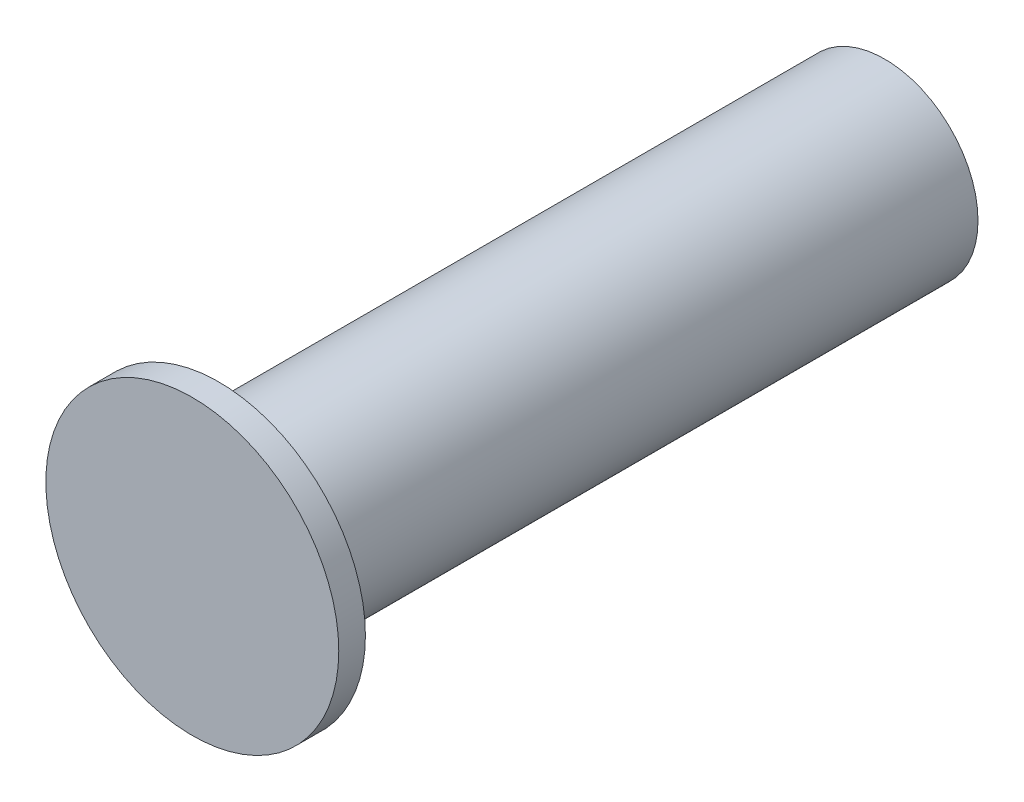
ISO-10303-21;
HEADER;
FILE_DESCRIPTION(('STEP AP214'),'2;1');
FILE_NAME('part.step','',(''),(''),'','','');
FILE_SCHEMA(('AUTOMOTIVE_DESIGN { 1 0 10303 214 1 1 1 1 }'));
ENDSEC;
DATA;
#1=APPLICATION_CONTEXT('core data for automotive mechanical design processes');
#2=APPLICATION_PROTOCOL_DEFINITION('international standard','automotive_design',2000,#1);
#3=PRODUCT_CONTEXT('',#1,'mechanical');
#4=PRODUCT('Part','Part','',(#3));
#5=PRODUCT_RELATED_PRODUCT_CATEGORY('part','',(#4));
#6=PRODUCT_DEFINITION_FORMATION('','',#4);
#7=PRODUCT_DEFINITION_CONTEXT('part definition',#1,'design');
#8=PRODUCT_DEFINITION('design','',#6,#7);
#9=PRODUCT_DEFINITION_SHAPE('','',#8);
#10=(LENGTH_UNIT() NAMED_UNIT(*) SI_UNIT(.MILLI.,.METRE.));
#11=(NAMED_UNIT(*) PLANE_ANGLE_UNIT() SI_UNIT($,.RADIAN.));
#12=(NAMED_UNIT(*) SI_UNIT($,.STERADIAN.) SOLID_ANGLE_UNIT());
#13=UNCERTAINTY_MEASURE_WITH_UNIT(LENGTH_MEASURE(1.E-05),#10,'distance_accuracy_value','');
#14=(GEOMETRIC_REPRESENTATION_CONTEXT(3) GLOBAL_UNCERTAINTY_ASSIGNED_CONTEXT((#13)) GLOBAL_UNIT_ASSIGNED_CONTEXT((#10,
#11,#12)) REPRESENTATION_CONTEXT('',''));
#15=CARTESIAN_POINT('',(0.,0.,0.));
#16=DIRECTION('',(0.,0.,1.));
#17=DIRECTION('',(1.,0.,0.));
#18=AXIS2_PLACEMENT_3D('',#15,#16,#17);
#19=CARTESIAN_POINT('',(0.,0.,0.508));
#20=DIRECTION('',(0.,0.,-1.));
#21=DIRECTION('',(-1.,0.,0.));
#22=AXIS2_PLACEMENT_3D('',#19,#20,#21);
#23=CYLINDRICAL_SURFACE('',#22,2.794);
#24=CARTESIAN_POINT('',(0.,0.,0.508));
#25=DIRECTION('',(0.,0.,1.));
#26=DIRECTION('',(1.,0.,0.));
#27=AXIS2_PLACEMENT_3D('',#24,#25,#26);
#28=CIRCLE('',#27,2.794);
#29=CARTESIAN_POINT('',(2.794,0.,0.508));
#30=VERTEX_POINT('',#29);
#31=EDGE_CURVE('E38',#30,#30,#28,.T.);
#32=ORIENTED_EDGE('',*,*,#31,.F.);
#33=EDGE_LOOP('',(#32));
#34=FACE_BOUND('',#33,.T.);
#35=CARTESIAN_POINT('',(0.,0.,0.));
#36=DIRECTION('',(0.,0.,1.));
#37=DIRECTION('',(1.,0.,0.));
#38=AXIS2_PLACEMENT_3D('',#35,#36,#37);
#39=CIRCLE('',#38,2.794);
#40=CARTESIAN_POINT('',(2.794,0.,0.));
#41=VERTEX_POINT('',#40);
#42=EDGE_CURVE('E34',#41,#41,#39,.T.);
#43=ORIENTED_EDGE('',*,*,#42,.T.);
#44=EDGE_LOOP('',(#43));
#45=FACE_BOUND('',#44,.T.);
#46=ADVANCED_FACE('F31',(#34,#45),#23,.T.);
#47=CARTESIAN_POINT('',(0.,0.,0.508));
#48=DIRECTION('',(0.,0.,1.));
#49=DIRECTION('',(1.,0.,0.));
#50=AXIS2_PLACEMENT_3D('',#47,#48,#49);
#51=PLANE('',#50);
#52=ORIENTED_EDGE('',*,*,#31,.T.);
#53=EDGE_LOOP('',(#52));
#54=FACE_BOUND('',#53,.T.);
#55=ADVANCED_FACE('F55',(#54),#51,.T.);
#56=CARTESIAN_POINT('',(0.,0.,0.));
#57=DIRECTION('',(0.,0.,1.));
#58=DIRECTION('',(1.,0.,0.));
#59=AXIS2_PLACEMENT_3D('',#56,#57,#58);
#60=PLANE('',#59);
#61=CARTESIAN_POINT('',(0.,0.,0.));
#62=DIRECTION('',(0.,0.,-1.));
#63=DIRECTION('',(-1.,0.,0.));
#64=AXIS2_PLACEMENT_3D('',#61,#62,#63);
#65=CIRCLE('',#64,1.77952089415153);
#66=CARTESIAN_POINT('',(1.77952089415153,0.,0.));
#67=VERTEX_POINT('',#66);
#68=EDGE_CURVE('E10',#67,#67,#65,.T.);
#69=ORIENTED_EDGE('',*,*,#68,.F.);
#70=EDGE_LOOP('',(#69));
#71=FACE_BOUND('',#70,.T.);
#72=ORIENTED_EDGE('',*,*,#42,.F.);
#73=EDGE_LOOP('',(#72));
#74=FACE_BOUND('',#73,.T.);
#75=ADVANCED_FACE('F52',(#71,#74),#60,.F.);
#76=CARTESIAN_POINT('',(0.,0.,-12.7));
#77=DIRECTION('',(0.,0.,1.));
#78=DIRECTION('',(1.,0.,0.));
#79=AXIS2_PLACEMENT_3D('',#76,#77,#78);
#80=CYLINDRICAL_SURFACE('',#79,1.77952089415153);
#81=CARTESIAN_POINT('',(0.,0.,-12.7));
#82=DIRECTION('',(0.,0.,-1.));
#83=DIRECTION('',(-1.,0.,0.));
#84=AXIS2_PLACEMENT_3D('',#81,#82,#83);
#85=CIRCLE('',#84,1.77952089415153);
#86=CARTESIAN_POINT('',(1.77952089415153,0.,-12.7));
#87=VERTEX_POINT('',#86);
#88=EDGE_CURVE('E44',#87,#87,#85,.T.);
#89=CARTESIAN_POINT('',(1.77952089415153,0.,-12.7));
#90=CARTESIAN_POINT('',(1.77952089415153,0.,-12.5677083333333));
#91=CARTESIAN_POINT('',(1.77952089415153,0.,-12.4354166666667));
#92=CARTESIAN_POINT('',(1.77952089415153,0.,-12.1708333333333));
#93=CARTESIAN_POINT('',(1.77952089415153,0.,-12.0385416666667));
#94=CARTESIAN_POINT('',(1.77952089415153,0.,-11.7739583333333));
#95=CARTESIAN_POINT('',(1.77952089415153,0.,-11.6416666666667));
#96=CARTESIAN_POINT('',(1.77952089415153,0.,-11.3770833333333));
#97=CARTESIAN_POINT('',(1.77952089415153,0.,-11.2447916666667));
#98=CARTESIAN_POINT('',(1.77952089415153,0.,-10.9802083333333));
#99=CARTESIAN_POINT('',(1.77952089415153,0.,-10.8479166666667));
#100=CARTESIAN_POINT('',(1.77952089415153,0.,-10.5833333333333));
#101=CARTESIAN_POINT('',(1.77952089415153,0.,-10.4510416666667));
#102=CARTESIAN_POINT('',(1.77952089415153,0.,-10.1864583333333));
#103=CARTESIAN_POINT('',(1.77952089415153,0.,-10.0541666666667));
#104=CARTESIAN_POINT('',(1.77952089415153,0.,-9.78958333333333));
#105=CARTESIAN_POINT('',(1.77952089415153,0.,-9.65729166666667));
#106=CARTESIAN_POINT('',(1.77952089415153,0.,-9.39270833333333));
#107=CARTESIAN_POINT('',(1.77952089415153,0.,-9.26041666666667));
#108=CARTESIAN_POINT('',(1.77952089415153,0.,-8.99583333333334));
#109=CARTESIAN_POINT('',(1.77952089415153,0.,-8.86354166666667));
#110=CARTESIAN_POINT('',(1.77952089415153,0.,-8.59895833333334));
#111=CARTESIAN_POINT('',(1.77952089415153,0.,-8.46666666666667));
#112=CARTESIAN_POINT('',(1.77952089415153,0.,-8.20208333333333));
#113=CARTESIAN_POINT('',(1.77952089415153,0.,-8.06979166666667));
#114=CARTESIAN_POINT('',(1.77952089415153,0.,-7.80520833333333));
#115=CARTESIAN_POINT('',(1.77952089415153,0.,-7.67291666666667));
#116=CARTESIAN_POINT('',(1.77952089415153,0.,-7.40833333333333));
#117=CARTESIAN_POINT('',(1.77952089415153,0.,-7.27604166666667));
#118=CARTESIAN_POINT('',(1.77952089415153,0.,-7.01145833333333));
#119=CARTESIAN_POINT('',(1.77952089415153,0.,-6.87916666666667));
#120=CARTESIAN_POINT('',(1.77952089415153,0.,-6.61458333333333));
#121=CARTESIAN_POINT('',(1.77952089415153,0.,-6.48229166666667));
#122=CARTESIAN_POINT('',(1.77952089415153,0.,-6.21770833333333));
#123=CARTESIAN_POINT('',(1.77952089415153,0.,-6.08541666666667));
#124=CARTESIAN_POINT('',(1.77952089415153,0.,-5.82083333333333));
#125=CARTESIAN_POINT('',(1.77952089415153,0.,-5.68854166666667));
#126=CARTESIAN_POINT('',(1.77952089415153,0.,-5.42395833333333));
#127=CARTESIAN_POINT('',(1.77952089415153,0.,-5.29166666666667));
#128=CARTESIAN_POINT('',(1.77952089415153,0.,-5.02708333333333));
#129=CARTESIAN_POINT('',(1.77952089415153,0.,-4.89479166666667));
#130=CARTESIAN_POINT('',(1.77952089415153,0.,-4.63020833333333));
#131=CARTESIAN_POINT('',(1.77952089415153,0.,-4.49791666666667));
#132=CARTESIAN_POINT('',(1.77952089415153,0.,-4.23333333333333));
#133=CARTESIAN_POINT('',(1.77952089415153,0.,-4.10104166666667));
#134=CARTESIAN_POINT('',(1.77952089415153,0.,-3.83645833333333));
#135=CARTESIAN_POINT('',(1.77952089415153,0.,-3.70416666666667));
#136=CARTESIAN_POINT('',(1.77952089415153,0.,-3.43958333333333));
#137=CARTESIAN_POINT('',(1.77952089415153,0.,-3.30729166666667));
#138=CARTESIAN_POINT('',(1.77952089415153,0.,-3.04270833333333));
#139=CARTESIAN_POINT('',(1.77952089415153,0.,-2.91041666666667));
#140=CARTESIAN_POINT('',(1.77952089415153,0.,-2.64583333333333));
#141=CARTESIAN_POINT('',(1.77952089415153,0.,-2.51354166666667));
#142=CARTESIAN_POINT('',(1.77952089415153,0.,-2.24895833333333));
#143=CARTESIAN_POINT('',(1.77952089415153,0.,-2.11666666666667));
#144=CARTESIAN_POINT('',(1.77952089415153,0.,-1.85208333333333));
#145=CARTESIAN_POINT('',(1.77952089415153,0.,-1.71979166666667));
#146=CARTESIAN_POINT('',(1.77952089415153,0.,-1.45520833333333));
#147=CARTESIAN_POINT('',(1.77952089415153,0.,-1.32291666666667));
#148=CARTESIAN_POINT('',(1.77952089415153,0.,-1.05833333333333));
#149=CARTESIAN_POINT('',(1.77952089415153,0.,-0.926041666666666));
#150=CARTESIAN_POINT('',(1.77952089415153,0.,-0.661458333333333));
#151=CARTESIAN_POINT('',(1.77952089415153,0.,-0.529166666666666));
#152=CARTESIAN_POINT('',(1.77952089415153,0.,-0.264583333333333));
#153=CARTESIAN_POINT('',(1.77952089415153,0.,-0.132291666666667));
#154=CARTESIAN_POINT('',(1.77952089415153,0.,0.));
#155=B_SPLINE_CURVE_WITH_KNOTS('',3,(#89,#90,#91,#92,#93,#94,#95,#96,#97,#98,#99,#100,#101,#102,
#103,#104,#105,#106,#107,#108,#109,#110,#111,#112,#113,#114,#115,#116,#117,#118,#119,#120,#121,
#122,#123,#124,#125,#126,#127,#128,#129,#130,#131,#132,#133,#134,#135,#136,#137,#138,#139,#140,
#141,#142,#143,#144,#145,#146,#147,#148,#149,#150,#151,#152,#153,#154),.UNSPECIFIED.,.F.,.F.,(4,
2,2,2,2,2,2,2,2,2,2,2,2,2,2,2,2,2,2,2,2,2,2,2,2,2,2,2,2,2,2,2,4),(0.,0.396875,0.793749999999999,
1.190625,1.5875,1.984375,2.38125,2.778125,3.175,3.571875,3.96875,4.365625,4.7625,5.159375,
5.55625,5.953125,6.35,6.746875,7.14375,7.540625,7.9375,8.334375,8.73125,9.128125,9.525,9.921875,
10.31875,10.715625,11.1125,11.509375,11.90625,12.303125,12.7),.UNSPECIFIED.);
#156=EDGE_CURVE('BSEAM54',#87,#67,#155,.T.);
#157=ORIENTED_EDGE('',*,*,#88,.F.);
#158=ORIENTED_EDGE('',*,*,#68,.T.);
#159=ORIENTED_EDGE('',*,*,#156,.T.);
#160=ORIENTED_EDGE('',*,*,#156,.F.);
#161=EDGE_LOOP('',(#157,#159,#158,#160));
#162=FACE_BOUND('',#161,.T.);
#163=ADVANCED_FACE('F54',(#162),#80,.T.);
#164=CARTESIAN_POINT('',(0.,0.,-12.7));
#165=DIRECTION('',(0.,0.,-1.));
#166=DIRECTION('',(-1.,0.,0.));
#167=AXIS2_PLACEMENT_3D('',#164,#165,#166);
#168=PLANE('',#167);
#169=ORIENTED_EDGE('',*,*,#88,.T.);
#170=EDGE_LOOP('',(#169));
#171=FACE_BOUND('',#170,.T.);
#172=ADVANCED_FACE('F61',(#171),#168,.T.);
#173=CLOSED_SHELL('',(#46,#55,#75,#163,#172));
#174=MANIFOLD_SOLID_BREP('B2',#173);
#175=ADVANCED_BREP_SHAPE_REPRESENTATION('',(#18,#174),#14);
#176=SHAPE_DEFINITION_REPRESENTATION(#9,#175);
ENDSEC;
END-ISO-10303-21;
